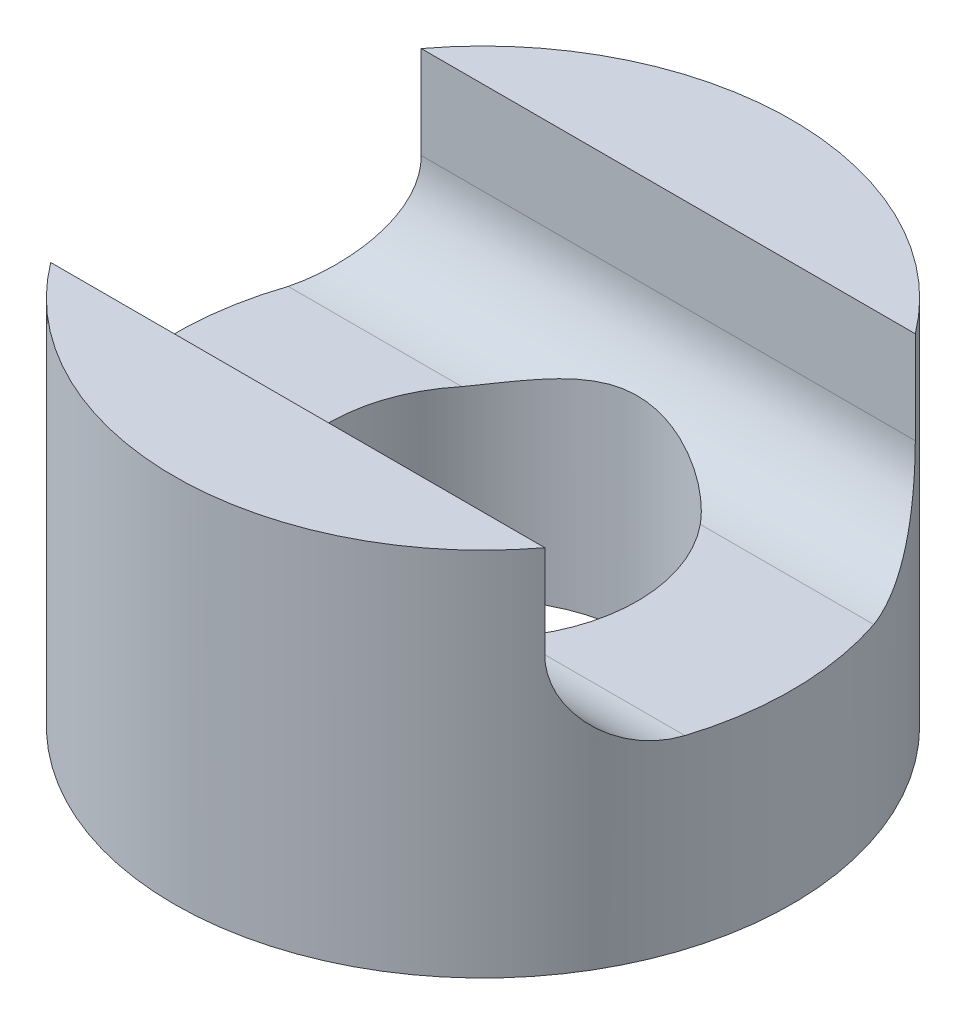
ISO-10303-21;
HEADER;
FILE_DESCRIPTION(('STEP AP214'),'2;1');
FILE_NAME('part.step','',(''),(''),'','','');
FILE_SCHEMA(('AUTOMOTIVE_DESIGN { 1 0 10303 214 1 1 1 1 }'));
ENDSEC;
DATA;
#1=APPLICATION_CONTEXT('core data for automotive mechanical design processes');
#2=APPLICATION_PROTOCOL_DEFINITION('international standard','automotive_design',2000,#1);
#3=PRODUCT_CONTEXT('',#1,'mechanical');
#4=PRODUCT('Part','Part','',(#3));
#5=PRODUCT_RELATED_PRODUCT_CATEGORY('part','',(#4));
#6=PRODUCT_DEFINITION_FORMATION('','',#4);
#7=PRODUCT_DEFINITION_CONTEXT('part definition',#1,'design');
#8=PRODUCT_DEFINITION('design','',#6,#7);
#9=PRODUCT_DEFINITION_SHAPE('','',#8);
#10=(LENGTH_UNIT() NAMED_UNIT(*) SI_UNIT(.MILLI.,.METRE.));
#11=(NAMED_UNIT(*) PLANE_ANGLE_UNIT() SI_UNIT($,.RADIAN.));
#12=(NAMED_UNIT(*) SI_UNIT($,.STERADIAN.) SOLID_ANGLE_UNIT());
#13=UNCERTAINTY_MEASURE_WITH_UNIT(LENGTH_MEASURE(1.E-05),#10,'distance_accuracy_value','');
#14=(GEOMETRIC_REPRESENTATION_CONTEXT(3) GLOBAL_UNCERTAINTY_ASSIGNED_CONTEXT((#13)) GLOBAL_UNIT_ASSIGNED_CONTEXT((#10,
#11,#12)) REPRESENTATION_CONTEXT('',''));
#15=CARTESIAN_POINT('',(0.,0.,0.));
#16=DIRECTION('',(0.,0.,1.));
#17=DIRECTION('',(1.,0.,0.));
#18=AXIS2_PLACEMENT_3D('',#15,#16,#17);
#19=CARTESIAN_POINT('',(0.,9.525,0.));
#20=DIRECTION('',(0.,1.,0.));
#21=DIRECTION('',(0.,0.,1.));
#22=AXIS2_PLACEMENT_3D('',#19,#20,#21);
#23=PLANE('',#22);
#24=DIRECTION('',(1.,0.,0.));
#25=VECTOR('',#24,1.);
#26=CARTESIAN_POINT('',(-7.9375,9.525,4.7625));
#27=LINE('',#26,#25);
#28=CARTESIAN_POINT('',(-6.35,9.525,4.7625));
#29=VERTEX_POINT('',#28);
#30=CARTESIAN_POINT('',(6.35,9.525,4.7625));
#31=VERTEX_POINT('',#30);
#32=EDGE_CURVE('E192',#29,#31,#27,.T.);
#33=ORIENTED_EDGE('',*,*,#32,.F.);
#34=CARTESIAN_POINT('',(0.,9.525,0.));
#35=DIRECTION('',(0.,1.,0.));
#36=DIRECTION('',(0.,0.,1.));
#37=AXIS2_PLACEMENT_3D('',#34,#35,#36);
#38=CIRCLE('',#37,7.9375);
#39=EDGE_CURVE('E166',#29,#31,#38,.T.);
#40=ORIENTED_EDGE('',*,*,#39,.T.);
#41=EDGE_LOOP('',(#33,#40));
#42=FACE_BOUND('',#41,.T.);
#43=ADVANCED_FACE('F33',(#42),#23,.T.);
#44=DIRECTION('',(1.,0.,0.));
#45=VECTOR('',#44,1.);
#46=CARTESIAN_POINT('',(-7.9375,9.525,-4.7625));
#47=LINE('',#46,#45);
#48=CARTESIAN_POINT('',(-6.35,9.525,-4.7625));
#49=VERTEX_POINT('',#48);
#50=CARTESIAN_POINT('',(6.35,9.525,-4.7625));
#51=VERTEX_POINT('',#50);
#52=EDGE_CURVE('E196',#49,#51,#47,.T.);
#53=ORIENTED_EDGE('',*,*,#52,.T.);
#54=EDGE_CURVE('E103',#51,#49,#38,.T.);
#55=ORIENTED_EDGE('',*,*,#54,.T.);
#56=EDGE_LOOP('',(#53,#55));
#57=FACE_BOUND('',#56,.T.);
#58=ADVANCED_FACE('F175',(#57),#23,.T.);
#59=CARTESIAN_POINT('',(0.,0.,0.));
#60=DIRECTION('',(0.,1.,0.));
#61=DIRECTION('',(0.,0.,1.));
#62=AXIS2_PLACEMENT_3D('',#59,#60,#61);
#63=PLANE('',#62);
#64=CARTESIAN_POINT('',(0.,0.,0.));
#65=DIRECTION('',(0.,1.,0.));
#66=DIRECTION('',(0.,0.,1.));
#67=AXIS2_PLACEMENT_3D('',#64,#65,#66);
#68=CIRCLE('',#67,7.9375);
#69=CARTESIAN_POINT('',(0.,0.,7.9375));
#70=VERTEX_POINT('',#69);
#71=EDGE_CURVE('E165',#70,#70,#68,.T.);
#72=ORIENTED_EDGE('',*,*,#71,.F.);
#73=EDGE_LOOP('',(#72));
#74=FACE_BOUND('',#73,.T.);
#75=CARTESIAN_POINT('',(0.,0.,0.));
#76=DIRECTION('',(0.,1.,0.));
#77=DIRECTION('',(0.,0.,1.));
#78=AXIS2_PLACEMENT_3D('',#75,#76,#77);
#79=CIRCLE('',#78,3.96875);
#80=CARTESIAN_POINT('',(0.,0.,3.96875));
#81=VERTEX_POINT('',#80);
#82=EDGE_CURVE('E162',#81,#81,#79,.T.);
#83=ORIENTED_EDGE('',*,*,#82,.T.);
#84=EDGE_LOOP('',(#83));
#85=FACE_BOUND('',#84,.T.);
#86=ADVANCED_FACE('F172',(#74,#85),#63,.F.);
#87=CARTESIAN_POINT('',(0.,9.525,0.));
#88=DIRECTION('',(0.,-1.,0.));
#89=DIRECTION('',(0.,0.,-1.));
#90=AXIS2_PLACEMENT_3D('',#87,#88,#89);
#91=CYLINDRICAL_SURFACE('',#90,7.9375);
#92=ORIENTED_EDGE('',*,*,#54,.F.);
#93=DIRECTION('',(0.,-1.,0.));
#94=VECTOR('',#93,1.);
#95=CARTESIAN_POINT('',(6.35,9.525,-4.7625));
#96=LINE('',#95,#94);
#97=CARTESIAN_POINT('',(6.35,7.14375,-4.7625));
#98=VERTEX_POINT('',#97);
#99=EDGE_CURVE('E11',#51,#98,#96,.T.);
#100=ORIENTED_EDGE('',*,*,#99,.T.);
#101=CARTESIAN_POINT('',(6.35,7.14375,-4.7625));
#102=CARTESIAN_POINT('',(6.34998327815844,7.08468544064043,-4.76251268833084));
#103=CARTESIAN_POINT('',(6.35164474149378,7.02563188785247,-4.76030682095958));
#104=CARTESIAN_POINT('',(6.35819680802518,6.90806949332682,-4.75155697137817));
#105=CARTESIAN_POINT('',(6.36308504315934,6.84956028401502,-4.74501617047307));
#106=CARTESIAN_POINT('',(6.37591780228869,6.73393541055343,-4.72775700371428));
#107=CARTESIAN_POINT('',(6.38384026172815,6.67681278043621,-4.71706879017699));
#108=CARTESIAN_POINT('',(6.40251536055102,6.56394571058362,-4.69168962466944));
#109=CARTESIAN_POINT('',(6.41326838511432,6.50820145954663,-4.67699812792767));
#110=CARTESIAN_POINT('',(6.44931387328704,6.34388140014782,-4.62730333149533));
#111=CARTESIAN_POINT('',(6.47844212120559,6.23780081847574,-4.58661547681015));
#112=CARTESIAN_POINT('',(6.54451261920529,6.03436447352946,-4.49183564552026));
#113=CARTESIAN_POINT('',(6.58146888215792,5.93702480829859,-4.43771960102167));
#114=CARTESIAN_POINT('',(6.66473605158109,5.74306888329638,-4.31177918316623));
#115=CARTESIAN_POINT('',(6.71161255783389,5.64749526682438,-4.23872619442164));
#116=CARTESIAN_POINT('',(6.80908860844584,5.46935371022602,-4.08030409666948));
#117=CARTESIAN_POINT('',(6.85969020206793,5.38679300845971,-3.99492818332966));
#118=CARTESIAN_POINT('',(6.97129155489573,5.22216630444347,-3.79736916144756));
#119=CARTESIAN_POINT('',(7.03255250338327,5.14275055736121,-3.6831132292344));
#120=CARTESIAN_POINT('',(7.15361713872745,5.00470194721938,-3.44206858638952));
#121=CARTESIAN_POINT('',(7.21342173856258,4.9460557342826,-3.31528799341713));
#122=CARTESIAN_POINT('',(7.31726688840676,4.86085525868493,-3.07810992987713));
#123=CARTESIAN_POINT('',(7.36206792111544,4.83022830289767,-2.96950766141815));
#124=CARTESIAN_POINT('',(7.42631532622718,4.7959215764762,-2.80308722316278));
#125=CARTESIAN_POINT('',(7.44724866810023,4.78642308509439,-2.74699813742241));
#126=CARTESIAN_POINT('',(7.48800934124686,4.77142800922462,-2.63386547372275));
#127=CARTESIAN_POINT('',(7.50783621369011,4.76593307370908,-2.57682151235635));
#128=CARTESIAN_POINT('',(7.52704515973077,4.7625,-2.51942402413201));
#129=B_SPLINE_CURVE_WITH_KNOTS('',3,(#101,#102,#103,#104,#105,#106,#107,#108,#109,#110,#111,
#112,#113,#114,#115,#116,#117,#118,#119,#120,#121,#122,#123,#124,#125,#126,#127,#128),
.UNSPECIFIED.,.F.,.F.,(4,2,2,2,2,2,2,2,2,2,2,2,2,4),(0.,0.177111203788205,0.354092573571492,
0.529810667029976,0.705552684366371,1.05577737023989,1.40663437059639,1.79252326974354,
2.17862606560031,2.63275851998708,3.08659854301565,3.44966259184463,3.63137961980222,
3.81317145057206),.UNSPECIFIED.);
#130=CARTESIAN_POINT('',(7.52704515973077,4.7625,-2.51942402413201));
#131=VERTEX_POINT('',#130);
#132=EDGE_CURVE('E154',#98,#131,#129,.T.);
#133=ORIENTED_EDGE('',*,*,#132,.T.);
#134=CARTESIAN_POINT('',(0.,4.7625,0.));
#135=DIRECTION('',(0.,-1.,0.));
#136=DIRECTION('',(0.,0.,-1.));
#137=AXIS2_PLACEMENT_3D('',#134,#135,#136);
#138=CIRCLE('',#137,7.9375);
#139=CARTESIAN_POINT('',(7.57189241124701,4.7625,2.38125));
#140=VERTEX_POINT('',#139);
#141=EDGE_CURVE('E155',#131,#140,#138,.T.);
#142=ORIENTED_EDGE('',*,*,#141,.T.);
#143=CARTESIAN_POINT('',(7.57189241124701,4.7625,2.38125));
#144=CARTESIAN_POINT('',(7.54942121199689,4.76249438331311,2.45273713340526));
#145=CARTESIAN_POINT('',(7.52592493319269,4.76571864049955,2.52388092001086));
#146=CARTESIAN_POINT('',(7.47713255183996,4.7784013004887,2.66494275693886));
#147=CARTESIAN_POINT('',(7.45183748730931,4.78785613346717,2.73486148562594));
#148=CARTESIAN_POINT('',(7.39976851517944,4.81272855229555,2.87276048406638));
#149=CARTESIAN_POINT('',(7.37300045162504,4.82812385226614,2.94074699111588));
#150=CARTESIAN_POINT('',(7.31818437715779,4.86462748333923,3.07462609200604));
#151=CARTESIAN_POINT('',(7.29013619244719,4.88573659211613,3.14051839945183));
#152=CARTESIAN_POINT('',(7.20463544820254,4.95717479049943,3.33420879026477));
#153=CARTESIAN_POINT('',(7.14567158811337,5.01569003178479,3.45842667425422));
#154=CARTESIAN_POINT('',(7.02641623496411,5.1528052375277,3.6947231190929));
#155=CARTESIAN_POINT('',(6.96612266842103,5.23143894614222,3.80678082985256));
#156=CARTESIAN_POINT('',(6.84361353621503,5.41288630025965,4.02308929694137));
#157=CARTESIAN_POINT('',(6.78151866357193,5.51691736262364,4.12639392293541));
#158=CARTESIAN_POINT('',(6.66402186189489,5.74442447224976,4.31357438109063));
#159=CARTESIAN_POINT('',(6.60861181045539,5.86787649290152,4.39747390755286));
#160=CARTESIAN_POINT('',(6.52185928782044,6.10033984709813,4.52478897968921));
#161=CARTESIAN_POINT('',(6.48793153071353,6.20571832158319,4.57308800391873));
#162=CARTESIAN_POINT('',(6.4299169028674,6.4246395582354,4.65430690427714));
#163=CARTESIAN_POINT('',(6.40580464504603,6.53816035373407,4.68726648685168));
#164=CARTESIAN_POINT('',(6.37546167622394,6.73407526272775,4.7284082605853));
#165=CARTESIAN_POINT('',(6.36599290626623,6.81504126253538,4.74112180113633));
#166=CARTESIAN_POINT('',(6.35322613699326,6.97855857459135,4.75819877761386));
#167=CARTESIAN_POINT('',(6.34994599234162,7.06111378174911,4.76253805396093));
#168=CARTESIAN_POINT('',(6.35,7.14375,4.7625));
#169=B_SPLINE_CURVE_WITH_KNOTS('',3,(#143,#144,#145,#146,#147,#148,#149,#150,#151,#152,#153,
#154,#155,#156,#157,#158,#159,#160,#161,#162,#163,#164,#165,#166,#167,#168),.UNSPECIFIED.,.F.,
.F.,(4,2,2,2,2,2,2,2,2,2,2,2,4),(0.,0.224699878655885,0.449271126749821,0.673007952541541,
0.896775245220057,1.34300145265279,1.78998106660669,2.26531434608285,2.74006412640544,
3.10100342588326,3.46100315793199,3.70788060679468,3.95546923348966),.UNSPECIFIED.);
#170=CARTESIAN_POINT('',(6.35,7.14375,4.7625));
#171=VERTEX_POINT('',#170);
#172=EDGE_CURVE('E201',#140,#171,#169,.T.);
#173=ORIENTED_EDGE('',*,*,#172,.T.);
#174=DIRECTION('',(0.,-1.,0.));
#175=VECTOR('',#174,1.);
#176=CARTESIAN_POINT('',(6.35,9.525,4.7625));
#177=LINE('',#176,#175);
#178=EDGE_CURVE('E131',#171,#31,#177,.F.);
#179=ORIENTED_EDGE('',*,*,#178,.T.);
#180=ORIENTED_EDGE('',*,*,#39,.F.);
#181=DIRECTION('',(0.,-1.,0.));
#182=VECTOR('',#181,1.);
#183=CARTESIAN_POINT('',(-6.35,9.525,4.7625));
#184=LINE('',#183,#182);
#185=CARTESIAN_POINT('',(-6.35,7.14375,4.7625));
#186=VERTEX_POINT('',#185);
#187=EDGE_CURVE('E42',#29,#186,#184,.T.);
#188=ORIENTED_EDGE('',*,*,#187,.T.);
#189=CARTESIAN_POINT('',(-6.35,7.14375,4.7625));
#190=CARTESIAN_POINT('',(-6.3499833227068,7.08479313674291,4.76251266468603));
#191=CARTESIAN_POINT('',(-6.35164167806306,7.02584725353408,4.76031090629273));
#192=CARTESIAN_POINT('',(-6.3581815628977,6.90849914546178,4.75157735005899));
#193=CARTESIAN_POINT('',(-6.36306073002922,6.85009655392802,4.74504872580133));
#194=CARTESIAN_POINT('',(-6.37586980313404,6.73468238526848,4.72782169328321));
#195=CARTESIAN_POINT('',(-6.3837776810862,6.67766385417477,4.71715338601936));
#196=CARTESIAN_POINT('',(-6.40241865807042,6.56500242991032,4.69182148826068));
#197=CARTESIAN_POINT('',(-6.41315214133784,6.50935972495563,4.67715735439032));
#198=CARTESIAN_POINT('',(-6.44913267065615,6.34533910891431,4.62755521051557));
#199=CARTESIAN_POINT('',(-6.47820908725309,6.23945186330194,4.58694330913771));
#200=CARTESIAN_POINT('',(-6.5441652341945,6.0363858485075,4.49234036208281));
#201=CARTESIAN_POINT('',(-6.58105901970168,5.93922321977242,4.43832518778642));
#202=CARTESIAN_POINT('',(-6.66418809008451,5.74562387171116,4.31262350874645));
#203=CARTESIAN_POINT('',(-6.71098822734921,5.65022769125228,4.23971127888236));
#204=CARTESIAN_POINT('',(-6.80831112741221,5.47241993552167,4.08159690936867));
#205=CARTESIAN_POINT('',(-6.85883579375245,5.39001506835891,3.99638846373493));
#206=CARTESIAN_POINT('',(-6.97027079541065,5.22570171760467,3.79923642531106));
#207=CARTESIAN_POINT('',(-7.03144254938203,5.14643877676599,3.68522748529974));
#208=CARTESIAN_POINT('',(-7.15238093600147,5.00862185177977,3.44462359155471));
#209=CARTESIAN_POINT('',(-7.21214820067413,4.95005837950712,3.31803443845995));
#210=CARTESIAN_POINT('',(-7.29757187637609,4.88002365678906,3.12316825864785));
#211=CARTESIAN_POINT('',(-7.32487301356868,4.85986662204575,3.05862024838493));
#212=CARTESIAN_POINT('',(-7.37823357874724,4.82502241170387,2.92755395036622));
#213=CARTESIAN_POINT('',(-7.40429318865364,4.81033443256398,2.8610359536024));
#214=CARTESIAN_POINT('',(-7.45496642812741,4.78663304087641,2.72627365230356));
#215=CARTESIAN_POINT('',(-7.47957657853897,4.77763281453082,2.65802571504885));
#216=CARTESIAN_POINT('',(-7.52708079254023,4.76556209437283,2.52037747418379));
#217=CARTESIAN_POINT('',(-7.54997390326822,4.76249486998339,2.45097655644711));
#218=CARTESIAN_POINT('',(-7.57189241124701,4.7625,2.38125));
#219=B_SPLINE_CURVE_WITH_KNOTS('',3,(#189,#190,#191,#192,#193,#194,#195,#196,#197,#198,#199,
#200,#201,#202,#203,#204,#205,#206,#207,#208,#209,#210,#211,#212,#213,#214,#215,#216,#217,#218),
.UNSPECIFIED.,.F.,.F.,(4,2,2,2,2,2,2,2,2,2,2,2,2,2,4),(0.,0.176788281696493,0.353447039559003,
0.528844623289433,0.704266070507116,1.05385153057578,1.40407094022676,1.78924832911174,
2.17462395880919,2.62789888878389,3.08096577845522,3.29954453647898,3.51809116712206,
3.73714262437352,3.95631475714057),.UNSPECIFIED.);
#220=CARTESIAN_POINT('',(-7.57189241124701,4.7625,2.38125));
#221=VERTEX_POINT('',#220);
#222=EDGE_CURVE('E195',#186,#221,#219,.T.);
#223=ORIENTED_EDGE('',*,*,#222,.T.);
#224=CARTESIAN_POINT('',(-7.52704515973077,4.7625,-2.51942402413201));
#225=VERTEX_POINT('',#224);
#226=EDGE_CURVE('E109',#221,#225,#138,.T.);
#227=ORIENTED_EDGE('',*,*,#226,.T.);
#228=CARTESIAN_POINT('',(-7.52704515973077,4.7625,-2.51942402413201));
#229=CARTESIAN_POINT('',(-7.50292866408066,4.76680701396852,-2.59150545025721));
#230=CARTESIAN_POINT('',(-7.47782377604945,4.77437416270729,-2.66303920640298));
#231=CARTESIAN_POINT('',(-7.4259233513946,4.79577471908196,-2.80449649149595));
#232=CARTESIAN_POINT('',(-7.39912874930267,4.8096046886468,-2.87442088182688));
#233=CARTESIAN_POINT('',(-7.3441943172286,4.84322930521229,-3.01200842245644));
#234=CARTESIAN_POINT('',(-7.31605897240638,4.86300509892211,-3.07967797996229));
#235=CARTESIAN_POINT('',(-7.25868304204327,4.9082712896512,-3.21258077304246));
#236=CARTESIAN_POINT('',(-7.2294423082801,4.93376245532411,-3.27781367953653));
#237=CARTESIAN_POINT('',(-7.14067340207079,5.01832636961128,-3.46905470039208));
#238=CARTESIAN_POINT('',(-7.07993989210637,5.08558720166352,-3.59099745324996));
#239=CARTESIAN_POINT('',(-6.95824662263422,5.24022835592179,-3.82148826981939));
#240=CARTESIAN_POINT('',(-6.89728665411196,5.32764259763073,-3.93001327210132));
#241=CARTESIAN_POINT('',(-6.77561454857692,5.52615997944563,-4.13642533319614));
#242=CARTESIAN_POINT('',(-6.71507924856965,5.63825660683623,-4.23346871772651));
#243=CARTESIAN_POINT('',(-6.60276340854685,5.8813968263716,-4.40659447095313));
#244=CARTESIAN_POINT('',(-6.5509675812191,6.01240657414792,-4.48271359084461));
#245=CARTESIAN_POINT('',(-6.47404801310929,6.25305957519002,-4.5928036996537));
#246=CARTESIAN_POINT('',(-6.44549784412742,6.35895557844908,-4.63260483432585));
#247=CARTESIAN_POINT('',(-6.39868959350447,6.57731478541998,-4.69705078334257));
#248=CARTESIAN_POINT('',(-6.38040572969257,6.6897607481204,-4.72173357926471));
#249=CARTESIAN_POINT('',(-6.36216797420542,6.85998163464165,-4.74624237739794));
#250=CARTESIAN_POINT('',(-6.35762115993166,6.91644489481891,-4.75232561398519));
#251=CARTESIAN_POINT('',(-6.35153235486445,7.02984420037966,-4.76045746597611));
#252=CARTESIAN_POINT('',(-6.34999158234544,7.08678042806141,-4.76250444558815));
#253=CARTESIAN_POINT('',(-6.35,7.14375,-4.7625));
#254=B_SPLINE_CURVE_WITH_KNOTS('',3,(#228,#229,#230,#231,#232,#233,#234,#235,#236,#237,#238,
#239,#240,#241,#242,#243,#244,#245,#246,#247,#248,#249,#250,#251,#252,#253),.UNSPECIFIED.,.F.,
.F.,(4,2,2,2,2,2,2,2,2,2,2,2,4),(0.,0.228283085037238,0.456441002227486,0.6838829618079,
0.911355528157094,1.36501323846556,1.81944013142975,2.2974360298503,2.77458693678103,
3.12324019416659,3.47101390343679,3.64173236096272,3.81251999210048),.UNSPECIFIED.);
#255=CARTESIAN_POINT('',(-6.35,7.14375,-4.7625));
#256=VERTEX_POINT('',#255);
#257=EDGE_CURVE('E148',#225,#256,#254,.T.);
#258=ORIENTED_EDGE('',*,*,#257,.T.);
#259=DIRECTION('',(0.,-1.,0.));
#260=VECTOR('',#259,1.);
#261=CARTESIAN_POINT('',(-6.35,9.525,-4.7625));
#262=LINE('',#261,#260);
#263=EDGE_CURVE('E204',#256,#49,#262,.F.);
#264=ORIENTED_EDGE('',*,*,#263,.T.);
#265=EDGE_LOOP('',(#92,#100,#133,#142,#173,#179,#180,#188,#223,#227,#258,#264));
#266=FACE_BOUND('',#265,.T.);
#267=ORIENTED_EDGE('',*,*,#71,.T.);
#268=EDGE_LOOP('',(#267));
#269=FACE_BOUND('',#268,.T.);
#270=ADVANCED_FACE('F35',(#266,#269),#91,.T.);
#271=CARTESIAN_POINT('',(0.,9.525,0.));
#272=DIRECTION('',(0.,-1.,0.));
#273=DIRECTION('',(0.,0.,-1.));
#274=AXIS2_PLACEMENT_3D('',#271,#272,#273);
#275=CYLINDRICAL_SURFACE('',#274,3.96875);
#276=CARTESIAN_POINT('',(-3.06650927752167,4.7625,-2.51942402413201));
#277=CARTESIAN_POINT('',(-3.00169143360752,4.76722986718235,-2.5983330270426));
#278=CARTESIAN_POINT('',(-2.93401360344071,4.77570810077165,-2.67448256458666));
#279=CARTESIAN_POINT('',(-2.79364439052368,4.79871716969196,-2.82077359582658));
#280=CARTESIAN_POINT('',(-2.7209626458262,4.81323662692134,-2.89092608657832));
#281=CARTESIAN_POINT('',(-2.49709219264168,4.86352422192367,-3.09118520211783));
#282=CARTESIAN_POINT('',(-2.33919361799692,4.90612357259009,-3.2121597756832));
#283=CARTESIAN_POINT('',(-2.01754261878834,4.99680245846915,-3.4228117330383));
#284=CARTESIAN_POINT('',(-1.85449897263094,5.04449191014256,-3.51377021956511));
#285=CARTESIAN_POINT('',(-1.51655664544007,5.1384456430024,-3.67231984318156));
#286=CARTESIAN_POINT('',(-1.34163541791079,5.18470695670738,-3.7398649641351));
#287=CARTESIAN_POINT('',(-0.992182159601172,5.26371023395166,-3.84679063686829));
#288=CARTESIAN_POINT('',(-0.818256391686591,5.29709677841551,-3.88761780128659));
#289=CARTESIAN_POINT('',(-0.552941466195332,5.3338190689905,-3.93106294573106));
#290=CARTESIAN_POINT('',(-0.463875750038945,5.34382951278412,-3.94257551502713));
#291=CARTESIAN_POINT('',(-0.284725141201024,5.35872725312992,-3.95954464079504));
#292=CARTESIAN_POINT('',(-0.19464031833846,5.36361489852199,-3.96500160962795));
#293=CARTESIAN_POINT('',(-0.0138029270721298,5.36787231954629,-3.96976100903641));
#294=CARTESIAN_POINT('',(0.0769508613878028,5.36721913966823,-3.9690378353332));
#295=CARTESIAN_POINT('',(0.257983834490143,5.36039767280994,-3.96139248083541));
#296=CARTESIAN_POINT('',(0.348263006831917,5.3542292435928,-3.95447014016586));
#297=CARTESIAN_POINT('',(0.527907894309408,5.33684341688753,-3.93452414720629));
#298=CARTESIAN_POINT('',(0.617270297569665,5.32561176700713,-3.92148326766814));
#299=CARTESIAN_POINT('',(0.794308156099895,5.29891460250228,-3.88949314600283));
#300=CARTESIAN_POINT('',(0.881982446105678,5.28344626815454,-3.87053996777696));
#301=CARTESIAN_POINT('',(1.18592253647014,5.22347914177439,-3.79404001687126));
#302=CARTESIAN_POINT('',(1.3969083746318,5.17035492932874,-3.72137011465355));
#303=CARTESIAN_POINT('',(1.70086644760138,5.08753488365934,-3.5875217818682));
#304=CARTESIAN_POINT('',(1.80010663793247,5.05940348208358,-3.53876008075653));
#305=CARTESIAN_POINT('',(1.99435253299106,5.00389645803939,-3.4330392458625));
#306=CARTESIAN_POINT('',(2.08935853631279,4.97652078232927,-3.37608069132277));
#307=CARTESIAN_POINT('',(2.34577047714973,4.90433682488982,-3.20728428724647));
#308=CARTESIAN_POINT('',(2.50244760476104,4.8621902615778,-3.08676666164942));
#309=CARTESIAN_POINT('',(2.72438396266455,4.81253673920161,-2.88767075882763));
#310=CARTESIAN_POINT('',(2.79631374086265,4.79823166117926,-2.81809434381623));
#311=CARTESIAN_POINT('',(2.93527203453993,4.77555109011145,-2.67306499200818));
#312=CARTESIAN_POINT('',(3.00229074192492,4.76718718772096,-2.59760088531185));
#313=CARTESIAN_POINT('',(3.06650927752167,4.76249999999999,-2.51942402413201));
#314=B_SPLINE_CURVE_WITH_KNOTS('',3,(#276,#277,#278,#279,#280,#281,#282,#283,#284,#285,#286,
#287,#288,#289,#290,#291,#292,#293,#294,#295,#296,#297,#298,#299,#300,#301,#302,#303,#304,#305,
#306,#307,#308,#309,#310,#311,#312,#313),.UNSPECIFIED.,.F.,.F.,(4,2,2,2,2,2,2,2,2,2,2,2,2,2,2,2,
2,2,4),(0.,0.306309756182572,0.612045198333131,1.21941065312078,1.7958132534981,
2.37334236433174,2.91622258100472,3.18700894365503,3.45777686575492,3.72966711920492,
4.00156438483924,4.27423183631505,4.54708120431291,5.23102355875112,5.57305075361535,
5.91505379048575,6.51836336557804,6.82123400810294,7.12469391092094),.UNSPECIFIED.);
#315=CARTESIAN_POINT('',(-3.06650927752167,4.7625,-2.51942402413201));
#316=VERTEX_POINT('',#315);
#317=CARTESIAN_POINT('',(3.06650927752167,4.7625,-2.51942402413201));
#318=VERTEX_POINT('',#317);
#319=EDGE_CURVE('E116',#316,#318,#314,.T.);
#320=ORIENTED_EDGE('',*,*,#319,.F.);
#321=CARTESIAN_POINT('',(0.,4.7625,0.));
#322=DIRECTION('',(0.,-1.,0.));
#323=DIRECTION('',(0.,0.,-1.));
#324=AXIS2_PLACEMENT_3D('',#321,#322,#323);
#325=CIRCLE('',#324,3.96875);
#326=CARTESIAN_POINT('',(-3.175,4.7625,2.38125));
#327=VERTEX_POINT('',#326);
#328=EDGE_CURVE('E102',#327,#316,#325,.T.);
#329=ORIENTED_EDGE('',*,*,#328,.F.);
#330=CARTESIAN_POINT('',(3.175,4.7625,2.38125));
#331=CARTESIAN_POINT('',(3.11360244132399,4.76250428745364,2.46315418595437));
#332=CARTESIAN_POINT('',(3.04907241539232,4.76672222450169,2.54255574856559));
#333=CARTESIAN_POINT('',(2.91460584930576,4.78209206811807,2.69561646286511));
#334=CARTESIAN_POINT('',(2.8446823444242,4.79322768872043,2.76928864589365));
#335=CARTESIAN_POINT('',(2.70046696870654,4.82086255397,2.9100797613722));
#336=CARTESIAN_POINT('',(2.62620674424898,4.83732615401263,2.97723849251167));
#337=CARTESIAN_POINT('',(2.47340089683477,4.87428408370968,3.10535208725622));
#338=CARTESIAN_POINT('',(2.39485244782293,4.89478109523717,3.16630278190311));
#339=CARTESIAN_POINT('',(2.22162165829562,4.94184169756031,3.29065479278532));
#340=CARTESIAN_POINT('',(2.12630740283694,4.96885371548176,3.35300871614924));
#341=CARTESIAN_POINT('',(1.93110999902681,5.0245355370825,3.46910754501959));
#342=CARTESIAN_POINT('',(1.83122642649026,5.05320549473945,3.52285164915401));
#343=CARTESIAN_POINT('',(1.52462205800793,5.13893590776561,3.67124789322961));
#344=CARTESIAN_POINT('',(1.31113974844706,5.19565705923076,3.75292638284027));
#345=CARTESIAN_POINT('',(1.00629338097934,5.26142464942058,3.84005928270382));
#346=CARTESIAN_POINT('',(0.920892454867672,5.27828699151895,3.86144293779815));
#347=CARTESIAN_POINT('',(0.748259889888489,5.30836059753452,3.89857231435066));
#348=CARTESIAN_POINT('',(0.661029496367686,5.32157426358591,3.9143217471714));
#349=CARTESIAN_POINT('',(0.485446188553544,5.34344218339907,3.93994459947496));
#350=CARTESIAN_POINT('',(0.397098103463313,5.35211179748066,3.9498378296253));
#351=CARTESIAN_POINT('',(0.219576375110232,5.36431681242734,3.96367080041544));
#352=CARTESIAN_POINT('',(0.130402761066066,5.36785239431194,3.96761075096056));
#353=CARTESIAN_POINT('',(-0.0483381058746357,5.36951029042791,3.9694650152075));
#354=CARTESIAN_POINT('',(-0.137905717617117,5.36761563910233,3.96736044410163));
#355=CARTESIAN_POINT('',(-0.316418722777799,5.35853013246587,3.95712664043801));
#356=CARTESIAN_POINT('',(-0.40536409949514,5.35133913554684,3.94899724679481));
#357=CARTESIAN_POINT('',(-0.582276884156787,5.3321808267258,3.92681836904247));
#358=CARTESIAN_POINT('',(-0.670240287086305,5.32019841227645,3.91275015789626));
#359=CARTESIAN_POINT('',(-0.844440742857756,5.29228872463793,3.87888944122014));
#360=CARTESIAN_POINT('',(-0.930676616165664,5.27635884916755,3.85909315812926));
#361=CARTESIAN_POINT('',(-1.23394468911697,5.21435710243383,3.77878404313119));
#362=CARTESIAN_POINT('',(-1.445454487889,5.15998838832083,3.70288415021221));
#363=CARTESIAN_POINT('',(-1.74982783032609,5.07624543662536,3.56392205437701));
#364=CARTESIAN_POINT('',(-1.84911821370729,5.04797209759958,3.51342876959822));
#365=CARTESIAN_POINT('',(-2.04339812955005,4.99249935331696,3.40410133628349));
#366=CARTESIAN_POINT('',(-2.1383874672845,4.9652999966911,3.34526681060032));
#367=CARTESIAN_POINT('',(-2.31972267313586,4.91491296230965,3.22201435577235));
#368=CARTESIAN_POINT('',(-2.40626388845531,4.89160507216309,3.15793290128276));
#369=CARTESIAN_POINT('',(-2.57443302060267,4.84934187095246,3.02240402761161));
#370=CARTESIAN_POINT('',(-2.65606447412799,4.83038339843819,2.95096201366744));
#371=CARTESIAN_POINT('',(-2.81435446007729,4.7984135619319,2.80042243528835));
#372=CARTESIAN_POINT('',(-2.89097593126935,4.78544297455924,2.72127669935762));
#373=CARTESIAN_POINT('',(-3.03797180550732,4.76747867922846,2.55617396095586));
#374=CARTESIAN_POINT('',(-3.10832823212678,4.76250726824299,2.47019861820699));
#375=CARTESIAN_POINT('',(-3.175,4.76249999999991,2.38125000000004));
#376=B_SPLINE_CURVE_WITH_KNOTS('',3,(#330,#331,#332,#333,#334,#335,#336,#337,#338,#339,#340,
#341,#342,#343,#344,#345,#346,#347,#348,#349,#350,#351,#352,#353,#354,#355,#356,#357,#358,#359,
#360,#361,#362,#363,#364,#365,#366,#367,#368,#369,#370,#371,#372,#373,#374,#375),.UNSPECIFIED.,
.F.,.F.,(4,2,2,2,2,2,2,2,2,2,2,2,2,2,2,2,2,2,2,2,2,2,4),(0.,0.306744809316229,0.612770186794029,
0.916789147270942,1.22101094154979,1.57169488956738,1.92241145908648,2.62456811787022,
2.89329681887279,3.16184817612678,3.42948579374587,3.69711397457064,3.96557921078151,
4.23405162519587,4.50337702049509,4.77288043747743,5.46222566411539,5.80675850255733,
6.15130692394051,6.48144369686111,6.81133973839657,7.14345033632509,7.47648506844268),.UNSPECIFIED.);
#377=CARTESIAN_POINT('',(3.175,4.7625,2.38125));
#378=VERTEX_POINT('',#377);
#379=EDGE_CURVE('E97',#378,#327,#376,.T.);
#380=ORIENTED_EDGE('',*,*,#379,.F.);
#381=EDGE_CURVE('E117',#318,#378,#325,.T.);
#382=ORIENTED_EDGE('',*,*,#381,.F.);
#383=EDGE_LOOP('',(#320,#329,#380,#382));
#384=FACE_BOUND('',#383,.T.);
#385=ORIENTED_EDGE('',*,*,#82,.F.);
#386=EDGE_LOOP('',(#385));
#387=FACE_BOUND('',#386,.T.);
#388=ADVANCED_FACE('F114',(#384,#387),#275,.F.);
#389=CARTESIAN_POINT('',(-7.9375,9.525,4.7625));
#390=DIRECTION('',(0.,0.,1.));
#391=DIRECTION('',(1.,0.,0.));
#392=AXIS2_PLACEMENT_3D('',#389,#390,#391);
#393=PLANE('',#392);
#394=ORIENTED_EDGE('',*,*,#32,.T.);
#395=ORIENTED_EDGE('',*,*,#178,.F.);
#396=DIRECTION('',(1.,0.,0.));
#397=VECTOR('',#396,1.);
#398=CARTESIAN_POINT('',(-7.9375,7.14375,4.7625));
#399=LINE('',#398,#397);
#400=EDGE_CURVE('E219',#186,#171,#399,.T.);
#401=ORIENTED_EDGE('',*,*,#400,.F.);
#402=ORIENTED_EDGE('',*,*,#187,.F.);
#403=EDGE_LOOP('',(#394,#395,#401,#402));
#404=FACE_BOUND('',#403,.T.);
#405=ADVANCED_FACE('F178',(#404),#393,.F.);
#406=CARTESIAN_POINT('',(-7.9375,9.525,-4.7625));
#407=DIRECTION('',(0.,0.,-1.));
#408=DIRECTION('',(-1.,0.,0.));
#409=AXIS2_PLACEMENT_3D('',#406,#407,#408);
#410=PLANE('',#409);
#411=ORIENTED_EDGE('',*,*,#52,.F.);
#412=ORIENTED_EDGE('',*,*,#263,.F.);
#413=DIRECTION('',(1.,0.,0.));
#414=VECTOR('',#413,1.);
#415=CARTESIAN_POINT('',(-7.9375,7.14375,-4.7625));
#416=LINE('',#415,#414);
#417=EDGE_CURVE('E212',#256,#98,#416,.T.);
#418=ORIENTED_EDGE('',*,*,#417,.T.);
#419=ORIENTED_EDGE('',*,*,#99,.F.);
#420=EDGE_LOOP('',(#411,#412,#418,#419));
#421=FACE_BOUND('',#420,.T.);
#422=ADVANCED_FACE('F142',(#421),#410,.F.);
#423=CARTESIAN_POINT('',(-7.9375,7.14375,-2.37699422330089));
#424=DIRECTION('',(1.,0.,0.));
#425=DIRECTION('',(0.,0.,-1.));
#426=AXIS2_PLACEMENT_3D('',#423,#424,#425);
#427=CYLINDRICAL_SURFACE('',#426,2.38550577669911);
#428=ORIENTED_EDGE('',*,*,#417,.F.);
#429=ORIENTED_EDGE('',*,*,#257,.F.);
#430=DIRECTION('',(1.,0.,0.));
#431=VECTOR('',#430,1.);
#432=CARTESIAN_POINT('',(-7.9375,4.7625,-2.51942402413201));
#433=LINE('',#432,#431);
#434=EDGE_CURVE('E214',#225,#316,#433,.T.);
#435=ORIENTED_EDGE('',*,*,#434,.T.);
#436=ORIENTED_EDGE('',*,*,#319,.T.);
#437=EDGE_CURVE('E111',#318,#131,#433,.T.);
#438=ORIENTED_EDGE('',*,*,#437,.T.);
#439=ORIENTED_EDGE('',*,*,#132,.F.);
#440=EDGE_LOOP('',(#428,#429,#435,#436,#438,#439));
#441=FACE_BOUND('',#440,.T.);
#442=ADVANCED_FACE('F136',(#441),#427,.F.);
#443=CARTESIAN_POINT('',(-7.9375,4.7625,2.38125));
#444=DIRECTION('',(0.,-1.,0.));
#445=DIRECTION('',(0.,0.,-1.));
#446=AXIS2_PLACEMENT_3D('',#443,#444,#445);
#447=PLANE('',#446);
#448=ORIENTED_EDGE('',*,*,#437,.F.);
#449=ORIENTED_EDGE('',*,*,#381,.T.);
#450=DIRECTION('',(1.,0.,0.));
#451=VECTOR('',#450,1.);
#452=CARTESIAN_POINT('',(-7.9375,4.7625,2.38125));
#453=LINE('',#452,#451);
#454=EDGE_CURVE('E55',#378,#140,#453,.T.);
#455=ORIENTED_EDGE('',*,*,#454,.T.);
#456=ORIENTED_EDGE('',*,*,#141,.F.);
#457=EDGE_LOOP('',(#448,#449,#455,#456));
#458=FACE_BOUND('',#457,.T.);
#459=ADVANCED_FACE('F141',(#458),#447,.F.);
#460=EDGE_CURVE('E49',#221,#327,#453,.T.);
#461=ORIENTED_EDGE('',*,*,#460,.T.);
#462=ORIENTED_EDGE('',*,*,#328,.T.);
#463=ORIENTED_EDGE('',*,*,#434,.F.);
#464=ORIENTED_EDGE('',*,*,#226,.F.);
#465=EDGE_LOOP('',(#461,#462,#463,#464));
#466=FACE_BOUND('',#465,.T.);
#467=ADVANCED_FACE('F106',(#466),#447,.F.);
#468=CARTESIAN_POINT('',(-7.9375,7.14375,2.38125));
#469=DIRECTION('',(1.,0.,0.));
#470=DIRECTION('',(0.,0.,-1.));
#471=AXIS2_PLACEMENT_3D('',#468,#469,#470);
#472=CYLINDRICAL_SURFACE('',#471,2.38125);
#473=ORIENTED_EDGE('',*,*,#454,.F.);
#474=ORIENTED_EDGE('',*,*,#379,.T.);
#475=ORIENTED_EDGE('',*,*,#460,.F.);
#476=ORIENTED_EDGE('',*,*,#222,.F.);
#477=ORIENTED_EDGE('',*,*,#400,.T.);
#478=ORIENTED_EDGE('',*,*,#172,.F.);
#479=EDGE_LOOP('',(#473,#474,#475,#476,#477,#478));
#480=FACE_BOUND('',#479,.T.);
#481=ADVANCED_FACE('F98',(#480),#472,.F.);
#482=CLOSED_SHELL('',(#43,#58,#86,#270,#388,#405,#422,#442,#459,#467,#481));
#483=MANIFOLD_SOLID_BREP('B2',#482);
#484=ADVANCED_BREP_SHAPE_REPRESENTATION('',(#18,#483),#14);
#485=SHAPE_DEFINITION_REPRESENTATION(#9,#484);
ENDSEC;
END-ISO-10303-21;
